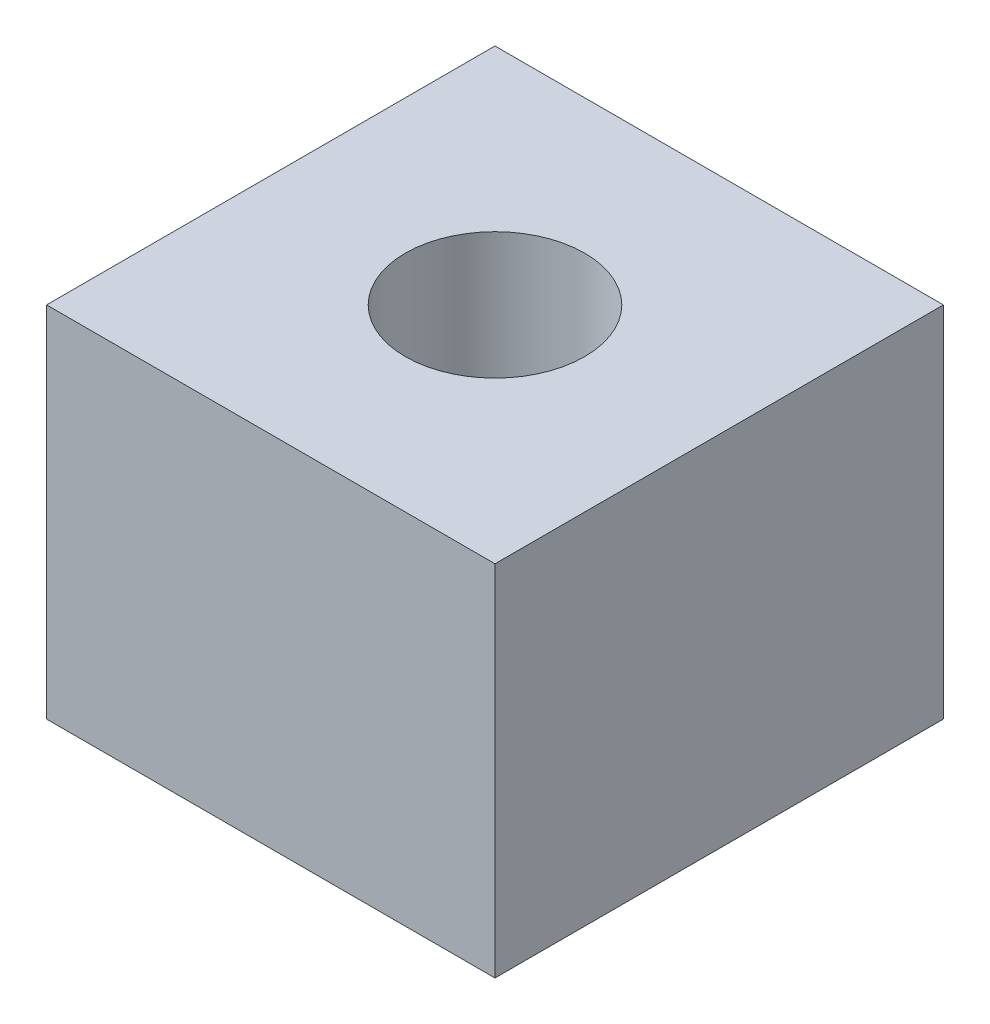
ISO-10303-21;
HEADER;
FILE_DESCRIPTION(('STEP AP214'),'2;1');
FILE_NAME('part.step','',(''),(''),'','','');
FILE_SCHEMA(('AUTOMOTIVE_DESIGN { 1 0 10303 214 1 1 1 1 }'));
ENDSEC;
DATA;
#1=APPLICATION_CONTEXT('core data for automotive mechanical design processes');
#2=APPLICATION_PROTOCOL_DEFINITION('international standard','automotive_design',2000,#1);
#3=PRODUCT_CONTEXT('',#1,'mechanical');
#4=PRODUCT('Part','Part','',(#3));
#5=PRODUCT_RELATED_PRODUCT_CATEGORY('part','',(#4));
#6=PRODUCT_DEFINITION_FORMATION('','',#4);
#7=PRODUCT_DEFINITION_CONTEXT('part definition',#1,'design');
#8=PRODUCT_DEFINITION('design','',#6,#7);
#9=PRODUCT_DEFINITION_SHAPE('','',#8);
#10=(LENGTH_UNIT() NAMED_UNIT(*) SI_UNIT(.MILLI.,.METRE.));
#11=(NAMED_UNIT(*) PLANE_ANGLE_UNIT() SI_UNIT($,.RADIAN.));
#12=(NAMED_UNIT(*) SI_UNIT($,.STERADIAN.) SOLID_ANGLE_UNIT());
#13=UNCERTAINTY_MEASURE_WITH_UNIT(LENGTH_MEASURE(1.E-05),#10,'distance_accuracy_value','');
#14=(GEOMETRIC_REPRESENTATION_CONTEXT(3) GLOBAL_UNCERTAINTY_ASSIGNED_CONTEXT((#13)) GLOBAL_UNIT_ASSIGNED_CONTEXT((#10,
#11,#12)) REPRESENTATION_CONTEXT('',''));
#15=CARTESIAN_POINT('',(0.,0.,0.));
#16=DIRECTION('',(0.,0.,1.));
#17=DIRECTION('',(1.,0.,0.));
#18=AXIS2_PLACEMENT_3D('',#15,#16,#17);
#19=CARTESIAN_POINT('',(7.5,7.,7.5));
#20=DIRECTION('',(-1.,0.,0.));
#21=DIRECTION('',(0.,0.,1.));
#22=AXIS2_PLACEMENT_3D('',#19,#20,#21);
#23=PLANE('',#22);
#24=DIRECTION('',(0.,0.,-1.));
#25=VECTOR('',#24,1.);
#26=CARTESIAN_POINT('',(7.5,-5.,7.5));
#27=LINE('',#26,#25);
#28=CARTESIAN_POINT('',(7.5,-5.,7.5));
#29=VERTEX_POINT('',#28);
#30=CARTESIAN_POINT('',(7.5,-5.,-7.5));
#31=VERTEX_POINT('',#30);
#32=EDGE_CURVE('E101',#29,#31,#27,.T.);
#33=ORIENTED_EDGE('',*,*,#32,.T.);
#34=DIRECTION('',(0.,-1.,0.));
#35=VECTOR('',#34,1.);
#36=CARTESIAN_POINT('',(7.5,7.,-7.5));
#37=LINE('',#36,#35);
#38=CARTESIAN_POINT('',(7.5,7.,-7.5));
#39=VERTEX_POINT('',#38);
#40=EDGE_CURVE('E11',#39,#31,#37,.T.);
#41=ORIENTED_EDGE('',*,*,#40,.F.);
#42=DIRECTION('',(0.,0.,-1.));
#43=VECTOR('',#42,1.);
#44=CARTESIAN_POINT('',(7.5,7.,7.5));
#45=LINE('',#44,#43);
#46=CARTESIAN_POINT('',(7.5,7.,7.5));
#47=VERTEX_POINT('',#46);
#48=EDGE_CURVE('E89',#47,#39,#45,.T.);
#49=ORIENTED_EDGE('',*,*,#48,.F.);
#50=DIRECTION('',(0.,-1.,0.));
#51=VECTOR('',#50,1.);
#52=CARTESIAN_POINT('',(7.5,7.,7.5));
#53=LINE('',#52,#51);
#54=EDGE_CURVE('E97',#47,#29,#53,.T.);
#55=ORIENTED_EDGE('',*,*,#54,.T.);
#56=EDGE_LOOP('',(#33,#41,#49,#55));
#57=FACE_BOUND('',#56,.T.);
#58=ADVANCED_FACE('F38',(#57),#23,.F.);
#59=CARTESIAN_POINT('',(-7.5,7.,-7.5));
#60=DIRECTION('',(0.,0.,1.));
#61=DIRECTION('',(1.,0.,0.));
#62=AXIS2_PLACEMENT_3D('',#59,#60,#61);
#63=PLANE('',#62);
#64=DIRECTION('',(-1.,0.,0.));
#65=VECTOR('',#64,1.);
#66=CARTESIAN_POINT('',(-7.5,-5.,-7.5));
#67=LINE('',#66,#65);
#68=CARTESIAN_POINT('',(-7.5,-5.,-7.5));
#69=VERTEX_POINT('',#68);
#70=EDGE_CURVE('E93',#31,#69,#67,.T.);
#71=ORIENTED_EDGE('',*,*,#70,.T.);
#72=DIRECTION('',(0.,-1.,0.));
#73=VECTOR('',#72,1.);
#74=CARTESIAN_POINT('',(-7.5,7.,-7.5));
#75=LINE('',#74,#73);
#76=CARTESIAN_POINT('',(-7.5,7.,-7.5));
#77=VERTEX_POINT('',#76);
#78=EDGE_CURVE('E46',#77,#69,#75,.T.);
#79=ORIENTED_EDGE('',*,*,#78,.F.);
#80=DIRECTION('',(-1.,0.,0.));
#81=VECTOR('',#80,1.);
#82=CARTESIAN_POINT('',(-7.5,7.,-7.5));
#83=LINE('',#82,#81);
#84=EDGE_CURVE('E84',#39,#77,#83,.T.);
#85=ORIENTED_EDGE('',*,*,#84,.F.);
#86=ORIENTED_EDGE('',*,*,#40,.T.);
#87=EDGE_LOOP('',(#71,#79,#85,#86));
#88=FACE_BOUND('',#87,.T.);
#89=ADVANCED_FACE('F92',(#88),#63,.F.);
#90=CARTESIAN_POINT('',(-7.5,7.,7.5));
#91=DIRECTION('',(1.,0.,0.));
#92=DIRECTION('',(0.,0.,-1.));
#93=AXIS2_PLACEMENT_3D('',#90,#91,#92);
#94=PLANE('',#93);
#95=DIRECTION('',(0.,0.,1.));
#96=VECTOR('',#95,1.);
#97=CARTESIAN_POINT('',(-7.5,-5.,7.5));
#98=LINE('',#97,#96);
#99=CARTESIAN_POINT('',(-7.5,-5.,7.5));
#100=VERTEX_POINT('',#99);
#101=EDGE_CURVE('E71',#69,#100,#98,.T.);
#102=ORIENTED_EDGE('',*,*,#101,.T.);
#103=DIRECTION('',(0.,-1.,0.));
#104=VECTOR('',#103,1.);
#105=CARTESIAN_POINT('',(-7.5,7.,7.5));
#106=LINE('',#105,#104);
#107=CARTESIAN_POINT('',(-7.5,7.,7.5));
#108=VERTEX_POINT('',#107);
#109=EDGE_CURVE('E94',#108,#100,#106,.T.);
#110=ORIENTED_EDGE('',*,*,#109,.F.);
#111=DIRECTION('',(0.,0.,1.));
#112=VECTOR('',#111,1.);
#113=CARTESIAN_POINT('',(-7.5,7.,7.5));
#114=LINE('',#113,#112);
#115=EDGE_CURVE('E87',#77,#108,#114,.T.);
#116=ORIENTED_EDGE('',*,*,#115,.F.);
#117=ORIENTED_EDGE('',*,*,#78,.T.);
#118=EDGE_LOOP('',(#102,#110,#116,#117));
#119=FACE_BOUND('',#118,.T.);
#120=ADVANCED_FACE('F95',(#119),#94,.F.);
#121=CARTESIAN_POINT('',(-7.5,7.,7.5));
#122=DIRECTION('',(0.,0.,-1.));
#123=DIRECTION('',(-1.,0.,0.));
#124=AXIS2_PLACEMENT_3D('',#121,#122,#123);
#125=PLANE('',#124);
#126=DIRECTION('',(1.,0.,0.));
#127=VECTOR('',#126,1.);
#128=CARTESIAN_POINT('',(-7.5,-5.,7.5));
#129=LINE('',#128,#127);
#130=EDGE_CURVE('E77',#100,#29,#129,.T.);
#131=ORIENTED_EDGE('',*,*,#130,.T.);
#132=ORIENTED_EDGE('',*,*,#54,.F.);
#133=DIRECTION('',(1.,0.,0.));
#134=VECTOR('',#133,1.);
#135=CARTESIAN_POINT('',(-7.5,7.,7.5));
#136=LINE('',#135,#134);
#137=EDGE_CURVE('E54',#108,#47,#136,.T.);
#138=ORIENTED_EDGE('',*,*,#137,.F.);
#139=ORIENTED_EDGE('',*,*,#109,.T.);
#140=EDGE_LOOP('',(#131,#132,#138,#139));
#141=FACE_BOUND('',#140,.T.);
#142=ADVANCED_FACE('F109',(#141),#125,.F.);
#143=CARTESIAN_POINT('',(0.,7.,0.));
#144=DIRECTION('',(0.,-1.,0.));
#145=DIRECTION('',(0.,0.,-1.));
#146=AXIS2_PLACEMENT_3D('',#143,#144,#145);
#147=PLANE('',#146);
#148=CARTESIAN_POINT('',(0.,7.,0.));
#149=DIRECTION('',(0.,-1.,0.));
#150=DIRECTION('',(0.,0.,-1.));
#151=AXIS2_PLACEMENT_3D('',#148,#149,#150);
#152=CIRCLE('',#151,3.);
#153=CARTESIAN_POINT('',(0.,7.,-3.));
#154=VERTEX_POINT('',#153);
#155=EDGE_CURVE('E104',#154,#154,#152,.T.);
#156=ORIENTED_EDGE('',*,*,#155,.T.);
#157=EDGE_LOOP('',(#156));
#158=FACE_BOUND('',#157,.T.);
#159=ORIENTED_EDGE('',*,*,#48,.T.);
#160=ORIENTED_EDGE('',*,*,#84,.T.);
#161=ORIENTED_EDGE('',*,*,#115,.T.);
#162=ORIENTED_EDGE('',*,*,#137,.T.);
#163=EDGE_LOOP('',(#159,#160,#161,#162));
#164=FACE_BOUND('',#163,.T.);
#165=ADVANCED_FACE('F85',(#158,#164),#147,.F.);
#166=CARTESIAN_POINT('',(0.,-5.,0.));
#167=DIRECTION('',(0.,-1.,0.));
#168=DIRECTION('',(0.,0.,-1.));
#169=AXIS2_PLACEMENT_3D('',#166,#167,#168);
#170=PLANE('',#169);
#171=CARTESIAN_POINT('',(0.,-5.,0.));
#172=DIRECTION('',(0.,1.,0.));
#173=DIRECTION('',(0.,0.,1.));
#174=AXIS2_PLACEMENT_3D('',#171,#172,#173);
#175=CIRCLE('',#174,3.);
#176=CARTESIAN_POINT('',(0.,-5.,3.));
#177=VERTEX_POINT('',#176);
#178=EDGE_CURVE('E117',#177,#177,#175,.T.);
#179=ORIENTED_EDGE('',*,*,#178,.T.);
#180=EDGE_LOOP('',(#179));
#181=FACE_BOUND('',#180,.T.);
#182=ORIENTED_EDGE('',*,*,#32,.F.);
#183=ORIENTED_EDGE('',*,*,#130,.F.);
#184=ORIENTED_EDGE('',*,*,#101,.F.);
#185=ORIENTED_EDGE('',*,*,#70,.F.);
#186=EDGE_LOOP('',(#182,#183,#184,#185));
#187=FACE_BOUND('',#186,.T.);
#188=ADVANCED_FACE('F112',(#181,#187),#170,.T.);
#189=CARTESIAN_POINT('',(0.,-5.,0.));
#190=DIRECTION('',(0.,1.,0.));
#191=DIRECTION('',(0.,0.,1.));
#192=AXIS2_PLACEMENT_3D('',#189,#190,#191);
#193=CYLINDRICAL_SURFACE('',#192,3.);
#194=ORIENTED_EDGE('',*,*,#178,.F.);
#195=EDGE_LOOP('',(#194));
#196=FACE_BOUND('',#195,.T.);
#197=ORIENTED_EDGE('',*,*,#155,.F.);
#198=EDGE_LOOP('',(#197));
#199=FACE_BOUND('',#198,.T.);
#200=ADVANCED_FACE('F122',(#196,#199),#193,.F.);
#201=CLOSED_SHELL('',(#58,#89,#120,#142,#165,#188,#200));
#202=MANIFOLD_SOLID_BREP('B2',#201);
#203=ADVANCED_BREP_SHAPE_REPRESENTATION('',(#18,#202),#14);
#204=SHAPE_DEFINITION_REPRESENTATION(#9,#203);
ENDSEC;
END-ISO-10303-21;
